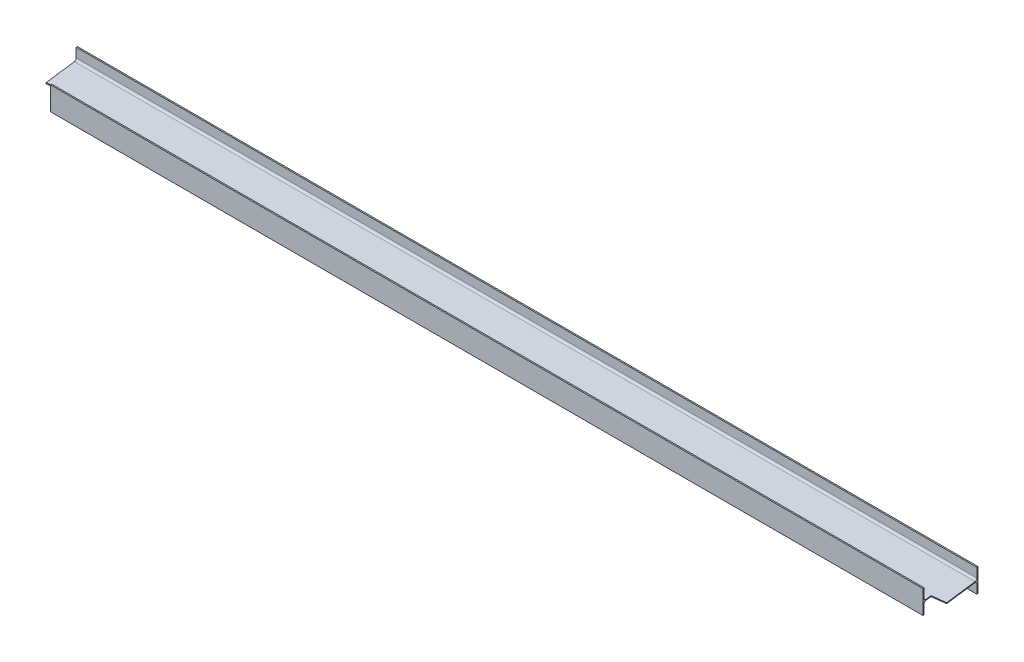
ISO-10303-21;
HEADER;
FILE_DESCRIPTION(('STEP AP214'),'2;1');
FILE_NAME('part.step','',(''),(''),'','','');
FILE_SCHEMA(('AUTOMOTIVE_DESIGN { 1 0 10303 214 1 1 1 1 }'));
ENDSEC;
DATA;
#1=APPLICATION_CONTEXT('core data for automotive mechanical design processes');
#2=APPLICATION_PROTOCOL_DEFINITION('international standard','automotive_design',2000,#1);
#3=PRODUCT_CONTEXT('',#1,'mechanical');
#4=PRODUCT('Part','Part','',(#3));
#5=PRODUCT_RELATED_PRODUCT_CATEGORY('part','',(#4));
#6=PRODUCT_DEFINITION_FORMATION('','',#4);
#7=PRODUCT_DEFINITION_CONTEXT('part definition',#1,'design');
#8=PRODUCT_DEFINITION('design','',#6,#7);
#9=PRODUCT_DEFINITION_SHAPE('','',#8);
#10=(LENGTH_UNIT() NAMED_UNIT(*) SI_UNIT(.MILLI.,.METRE.));
#11=(NAMED_UNIT(*) PLANE_ANGLE_UNIT() SI_UNIT($,.RADIAN.));
#12=(NAMED_UNIT(*) SI_UNIT($,.STERADIAN.) SOLID_ANGLE_UNIT());
#13=UNCERTAINTY_MEASURE_WITH_UNIT(LENGTH_MEASURE(1.E-05),#10,'distance_accuracy_value','');
#14=(GEOMETRIC_REPRESENTATION_CONTEXT(3) GLOBAL_UNCERTAINTY_ASSIGNED_CONTEXT((#13)) GLOBAL_UNIT_ASSIGNED_CONTEXT((#10,
#11,#12)) REPRESENTATION_CONTEXT('',''));
#15=CARTESIAN_POINT('',(0.,0.,0.));
#16=DIRECTION('',(0.,0.,1.));
#17=DIRECTION('',(1.,0.,0.));
#18=AXIS2_PLACEMENT_3D('',#15,#16,#17);
#19=CARTESIAN_POINT('',(5791.,15.7500000000001,128.));
#20=DIRECTION('',(-1.,0.,0.));
#21=DIRECTION('',(0.,0.,1.));
#22=AXIS2_PLACEMENT_3D('',#19,#20,#21);
#23=CYLINDRICAL_SURFACE('',#22,13.);
#24=DIRECTION('',(-1.,0.,0.));
#25=VECTOR('',#24,1.);
#26=CARTESIAN_POINT('',(5791.,2.75000000000004,128.));
#27=LINE('',#26,#25);
#28=CARTESIAN_POINT('',(5697.67460033164,2.75000000000004,128.));
#29=VERTEX_POINT('',#28);
#30=CARTESIAN_POINT('',(125.325399668359,2.75000000000004,128.));
#31=VERTEX_POINT('',#30);
#32=EDGE_CURVE('E271',#29,#31,#27,.T.);
#33=ORIENTED_EDGE('',*,*,#32,.T.);
#34=CARTESIAN_POINT('',(125.325399668359,15.7500000000001,128.));
#35=DIRECTION('',(0.992277876713668,0.,-0.124034734589205));
#36=DIRECTION('',(-0.124034734589205,0.,-0.992277876713668));
#37=AXIS2_PLACEMENT_3D('',#34,#35,#36);
#38=ELLIPSE('',#37,13.1011688409852,13.);
#39=CARTESIAN_POINT('',(126.950399668359,15.7500000000001,141.));
#40=VERTEX_POINT('',#39);
#41=EDGE_CURVE('E299',#31,#40,#38,.F.);
#42=ORIENTED_EDGE('',*,*,#41,.T.);
#43=DIRECTION('',(-1.,0.,0.));
#44=VECTOR('',#43,1.);
#45=CARTESIAN_POINT('',(5791.,15.7500000000001,141.));
#46=LINE('',#45,#44);
#47=CARTESIAN_POINT('',(5699.29960033164,15.7500000000001,141.));
#48=VERTEX_POINT('',#47);
#49=EDGE_CURVE('E251',#48,#40,#46,.T.);
#50=ORIENTED_EDGE('',*,*,#49,.F.);
#51=CARTESIAN_POINT('',(5697.67460033164,15.7500000000001,128.));
#52=DIRECTION('',(-0.992277876713666,0.,0.124034734589219));
#53=DIRECTION('',(-0.124034734589219,0.,-0.992277876713667));
#54=AXIS2_PLACEMENT_3D('',#51,#52,#53);
#55=ELLIPSE('',#54,13.1011688409852,13.);
#56=EDGE_CURVE('E276',#48,#29,#55,.F.);
#57=ORIENTED_EDGE('',*,*,#56,.T.);
#58=EDGE_LOOP('',(#33,#42,#50,#57));
#59=FACE_BOUND('',#58,.T.);
#60=ADVANCED_FACE('F87',(#59),#23,.F.);
#61=CARTESIAN_POINT('',(5791.,74.5,141.));
#62=DIRECTION('',(0.,0.,1.));
#63=DIRECTION('',(0.,-1.,0.));
#64=AXIS2_PLACEMENT_3D('',#61,#62,#63);
#65=PLANE('',#64);
#66=ORIENTED_EDGE('',*,*,#49,.T.);
#67=DIRECTION('',(0.,1.,0.));
#68=VECTOR('',#67,1.);
#69=CARTESIAN_POINT('',(126.950399668359,74.4999999999995,141.));
#70=LINE('',#69,#68);
#71=CARTESIAN_POINT('',(126.950399668359,74.5,141.));
#72=VERTEX_POINT('',#71);
#73=EDGE_CURVE('E301',#40,#72,#70,.T.);
#74=ORIENTED_EDGE('',*,*,#73,.T.);
#75=DIRECTION('',(-1.,0.,0.));
#76=VECTOR('',#75,1.);
#77=CARTESIAN_POINT('',(5791.,74.5,141.));
#78=LINE('',#77,#76);
#79=CARTESIAN_POINT('',(5699.29960033164,74.5,141.));
#80=VERTEX_POINT('',#79);
#81=EDGE_CURVE('E244',#80,#72,#78,.T.);
#82=ORIENTED_EDGE('',*,*,#81,.F.);
#83=DIRECTION('',(0.,-1.,0.));
#84=VECTOR('',#83,1.);
#85=CARTESIAN_POINT('',(5699.29960033164,74.5,141.));
#86=LINE('',#85,#84);
#87=EDGE_CURVE('E282',#80,#48,#86,.T.);
#88=ORIENTED_EDGE('',*,*,#87,.T.);
#89=EDGE_LOOP('',(#66,#74,#82,#88));
#90=FACE_BOUND('',#89,.T.);
#91=ADVANCED_FACE('F443',(#90),#65,.F.);
#92=CARTESIAN_POINT('',(5791.,74.5,149.));
#93=DIRECTION('',(0.,-1.,0.));
#94=DIRECTION('',(0.,0.,-1.));
#95=AXIS2_PLACEMENT_3D('',#92,#93,#94);
#96=PLANE('',#95);
#97=ORIENTED_EDGE('',*,*,#81,.T.);
#98=DIRECTION('',(-0.124034734589205,0.,-0.992277876713668));
#99=VECTOR('',#98,1.);
#100=CARTESIAN_POINT('',(117.872577482986,74.5000000000001,68.3774225170143));
#101=LINE('',#100,#99);
#102=CARTESIAN_POINT('',(127.950399668359,74.5,149.));
#103=VERTEX_POINT('',#102);
#104=EDGE_CURVE('E227',#103,#72,#101,.T.);
#105=ORIENTED_EDGE('',*,*,#104,.F.);
#106=DIRECTION('',(-1.,0.,0.));
#107=VECTOR('',#106,1.);
#108=CARTESIAN_POINT('',(5791.,74.5,149.));
#109=LINE('',#108,#107);
#110=CARTESIAN_POINT('',(5700.29960033164,74.5,149.));
#111=VERTEX_POINT('',#110);
#112=EDGE_CURVE('E242',#111,#103,#109,.T.);
#113=ORIENTED_EDGE('',*,*,#112,.F.);
#114=DIRECTION('',(0.124034734589219,0.,0.992277876713666));
#115=VECTOR('',#114,1.);
#116=CARTESIAN_POINT('',(5693.01255967453,74.5,90.703674743072));
#117=LINE('',#116,#115);
#118=EDGE_CURVE('E402',#80,#111,#117,.T.);
#119=ORIENTED_EDGE('',*,*,#118,.F.);
#120=EDGE_LOOP('',(#97,#105,#113,#119));
#121=FACE_BOUND('',#120,.T.);
#122=ADVANCED_FACE('F240',(#121),#96,.F.);
#123=CARTESIAN_POINT('',(5791.,74.5,149.));
#124=DIRECTION('',(0.,0.,-1.));
#125=DIRECTION('',(0.,1.,0.));
#126=AXIS2_PLACEMENT_3D('',#123,#124,#125);
#127=PLANE('',#126);
#128=ORIENTED_EDGE('',*,*,#112,.T.);
#129=DIRECTION('',(0.,1.,0.));
#130=VECTOR('',#129,1.);
#131=CARTESIAN_POINT('',(127.950399668359,-74.5,149.));
#132=LINE('',#131,#130);
#133=CARTESIAN_POINT('',(127.950399668359,-74.5,149.));
#134=VERTEX_POINT('',#133);
#135=EDGE_CURVE('E224',#134,#103,#132,.T.);
#136=ORIENTED_EDGE('',*,*,#135,.F.);
#137=DIRECTION('',(-1.,0.,0.));
#138=VECTOR('',#137,1.);
#139=CARTESIAN_POINT('',(5791.,-74.5,149.));
#140=LINE('',#139,#138);
#141=CARTESIAN_POINT('',(5700.29960033164,-74.5,149.));
#142=VERTEX_POINT('',#141);
#143=EDGE_CURVE('E249',#142,#134,#140,.T.);
#144=ORIENTED_EDGE('',*,*,#143,.F.);
#145=DIRECTION('',(0.,1.,0.));
#146=VECTOR('',#145,1.);
#147=CARTESIAN_POINT('',(5700.29960033164,-74.5,149.));
#148=LINE('',#147,#146);
#149=EDGE_CURVE('E245',#142,#111,#148,.T.);
#150=ORIENTED_EDGE('',*,*,#149,.T.);
#151=EDGE_LOOP('',(#128,#136,#144,#150));
#152=FACE_BOUND('',#151,.T.);
#153=ADVANCED_FACE('F248',(#152),#127,.F.);
#154=CARTESIAN_POINT('',(5791.,-74.5,149.));
#155=DIRECTION('',(0.,1.,0.));
#156=DIRECTION('',(0.,0.,1.));
#157=AXIS2_PLACEMENT_3D('',#154,#155,#156);
#158=PLANE('',#157);
#159=ORIENTED_EDGE('',*,*,#143,.T.);
#160=DIRECTION('',(-0.124034734589205,0.,-0.992277876713668));
#161=VECTOR('',#160,1.);
#162=CARTESIAN_POINT('',(117.872577482986,-74.5,68.3774225170143));
#163=LINE('',#162,#161);
#164=CARTESIAN_POINT('',(126.950399668359,-74.5,141.));
#165=VERTEX_POINT('',#164);
#166=EDGE_CURVE('E230',#134,#165,#163,.T.);
#167=ORIENTED_EDGE('',*,*,#166,.T.);
#168=DIRECTION('',(-1.,0.,0.));
#169=VECTOR('',#168,1.);
#170=CARTESIAN_POINT('',(5791.,-74.5,141.));
#171=LINE('',#170,#169);
#172=CARTESIAN_POINT('',(5699.29960033164,-74.5,141.));
#173=VERTEX_POINT('',#172);
#174=EDGE_CURVE('E253',#173,#165,#171,.T.);
#175=ORIENTED_EDGE('',*,*,#174,.F.);
#176=DIRECTION('',(0.124034734589219,0.,0.992277876713666));
#177=VECTOR('',#176,1.);
#178=CARTESIAN_POINT('',(5693.01255967453,-74.5,90.703674743072));
#179=LINE('',#178,#177);
#180=EDGE_CURVE('E398',#173,#142,#179,.T.);
#181=ORIENTED_EDGE('',*,*,#180,.T.);
#182=EDGE_LOOP('',(#159,#167,#175,#181));
#183=FACE_BOUND('',#182,.T.);
#184=ADVANCED_FACE('F397',(#183),#158,.F.);
#185=CARTESIAN_POINT('',(5791.,-15.75,141.));
#186=DIRECTION('',(0.,0.,1.));
#187=DIRECTION('',(1.,0.,0.));
#188=AXIS2_PLACEMENT_3D('',#185,#186,#187);
#189=PLANE('',#188);
#190=ORIENTED_EDGE('',*,*,#174,.T.);
#191=DIRECTION('',(0.,1.,0.));
#192=VECTOR('',#191,1.);
#193=CARTESIAN_POINT('',(126.950399668359,-15.7500000000002,141.));
#194=LINE('',#193,#192);
#195=CARTESIAN_POINT('',(126.950399668359,-15.75,141.));
#196=VERTEX_POINT('',#195);
#197=EDGE_CURVE('E309',#165,#196,#194,.T.);
#198=ORIENTED_EDGE('',*,*,#197,.T.);
#199=DIRECTION('',(-1.,0.,0.));
#200=VECTOR('',#199,1.);
#201=CARTESIAN_POINT('',(5791.,-15.75,141.));
#202=LINE('',#201,#200);
#203=CARTESIAN_POINT('',(5699.29960033164,-15.75,141.));
#204=VERTEX_POINT('',#203);
#205=EDGE_CURVE('E388',#204,#196,#202,.T.);
#206=ORIENTED_EDGE('',*,*,#205,.F.);
#207=DIRECTION('',(0.,-1.,0.));
#208=VECTOR('',#207,1.);
#209=CARTESIAN_POINT('',(5699.29960033164,-15.75,141.));
#210=LINE('',#209,#208);
#211=EDGE_CURVE('E296',#204,#173,#210,.T.);
#212=ORIENTED_EDGE('',*,*,#211,.T.);
#213=EDGE_LOOP('',(#190,#198,#206,#212));
#214=FACE_BOUND('',#213,.T.);
#215=ADVANCED_FACE('F393',(#214),#189,.F.);
#216=CARTESIAN_POINT('',(5791.,-15.75,128.));
#217=DIRECTION('',(-1.,0.,0.));
#218=DIRECTION('',(0.,0.,1.));
#219=AXIS2_PLACEMENT_3D('',#216,#217,#218);
#220=CYLINDRICAL_SURFACE('',#219,13.);
#221=ORIENTED_EDGE('',*,*,#205,.T.);
#222=CARTESIAN_POINT('',(125.325399668359,-15.75,128.));
#223=DIRECTION('',(0.992277876713668,0.,-0.124034734589205));
#224=DIRECTION('',(-0.124034734589205,0.,-0.992277876713668));
#225=AXIS2_PLACEMENT_3D('',#222,#223,#224);
#226=ELLIPSE('',#225,13.1011688409851,13.);
#227=CARTESIAN_POINT('',(125.325399668359,-2.75000000000004,128.));
#228=VERTEX_POINT('',#227);
#229=EDGE_CURVE('E306',#196,#228,#226,.F.);
#230=ORIENTED_EDGE('',*,*,#229,.T.);
#231=DIRECTION('',(-1.,0.,0.));
#232=VECTOR('',#231,1.);
#233=CARTESIAN_POINT('',(5791.,-2.75000000000004,128.));
#234=LINE('',#233,#232);
#235=CARTESIAN_POINT('',(5697.67460033164,-2.75000000000004,128.));
#236=VERTEX_POINT('',#235);
#237=EDGE_CURVE('E385',#236,#228,#234,.T.);
#238=ORIENTED_EDGE('',*,*,#237,.F.);
#239=CARTESIAN_POINT('',(5697.67460033164,-15.75,128.));
#240=DIRECTION('',(-0.992277876713666,0.,0.124034734589219));
#241=DIRECTION('',(-0.124034734589219,0.,-0.992277876713667));
#242=AXIS2_PLACEMENT_3D('',#239,#240,#241);
#243=ELLIPSE('',#242,13.1011688409852,13.);
#244=EDGE_CURVE('E293',#236,#204,#243,.F.);
#245=ORIENTED_EDGE('',*,*,#244,.T.);
#246=EDGE_LOOP('',(#221,#230,#238,#245));
#247=FACE_BOUND('',#246,.T.);
#248=ADVANCED_FACE('F446',(#247),#220,.F.);
#249=CARTESIAN_POINT('',(5791.,-2.75000000000004,128.));
#250=DIRECTION('',(0.,1.,0.));
#251=DIRECTION('',(0.,0.,1.));
#252=AXIS2_PLACEMENT_3D('',#249,#250,#251);
#253=PLANE('',#252);
#254=DIRECTION('',(-0.124034734589205,0.,-0.992277876713668));
#255=VECTOR('',#254,1.);
#256=CARTESIAN_POINT('',(212.489624288841,-2.75000000000004,825.313796963874));
#257=LINE('',#256,#255);
#258=CARTESIAN_POINT('',(117.872577482986,-2.75000000000004,68.3774225170143));
#259=VERTEX_POINT('',#258);
#260=EDGE_CURVE('E303',#228,#259,#257,.T.);
#261=ORIENTED_EDGE('',*,*,#260,.T.);
#262=DIRECTION('',(-0.992277876713668,0.,0.12403473458921));
#263=VECTOR('',#262,1.);
#264=CARTESIAN_POINT('',(5696.38295319414,-2.75000000000004,-628.936374446886));
#265=LINE('',#264,#263);
#266=CARTESIAN_POINT('',(28.5675685787561,-2.75000000000004,79.5405486300432));
#267=VERTEX_POINT('',#266);
#268=EDGE_CURVE('E283',#259,#267,#265,.T.);
#269=ORIENTED_EDGE('',*,*,#268,.T.);
#270=DIRECTION('',(-0.124034734589209,0.,-0.992277876713668));
#271=VECTOR('',#270,1.);
#272=CARTESIAN_POINT('',(123.184615384617,-2.75000000000004,836.476923076927));
#273=LINE('',#272,#271);
#274=CARTESIAN_POINT('',(2.6250000000001,-2.75000000000004,-128.));
#275=VERTEX_POINT('',#274);
#276=EDGE_CURVE('E338',#267,#275,#273,.T.);
#277=ORIENTED_EDGE('',*,*,#276,.T.);
#278=DIRECTION('',(-1.,0.,0.));
#279=VECTOR('',#278,1.);
#280=CARTESIAN_POINT('',(5791.,-2.75000000000004,-128.));
#281=LINE('',#280,#279);
#282=CARTESIAN_POINT('',(5756.375,-2.75000000000004,-128.));
#283=VERTEX_POINT('',#282);
#284=EDGE_CURVE('E382',#283,#275,#281,.T.);
#285=ORIENTED_EDGE('',*,*,#284,.F.);
#286=DIRECTION('',(0.124034734589206,0.,0.992277876713668));
#287=VECTOR('',#286,1.);
#288=CARTESIAN_POINT('',(5788.41538461539,-2.75000000000004,128.323076923077));
#289=LINE('',#288,#287);
#290=CARTESIAN_POINT('',(5782.31756857876,-2.75000000000004,79.5405486300431));
#291=VERTEX_POINT('',#290);
#292=EDGE_CURVE('E354',#283,#291,#289,.T.);
#293=ORIENTED_EDGE('',*,*,#292,.T.);
#294=DIRECTION('',(-0.992277876713667,0.,0.12403473458921));
#295=VECTOR('',#294,1.);
#296=CARTESIAN_POINT('',(5784.90218396337,-2.75000000000004,79.2174717069663));
#297=LINE('',#296,#295);
#298=CARTESIAN_POINT('',(5693.01255967453,-2.75000000000004,90.703674743072));
#299=VERTEX_POINT('',#298);
#300=EDGE_CURVE('E109',#291,#299,#297,.T.);
#301=ORIENTED_EDGE('',*,*,#300,.T.);
#302=DIRECTION('',(0.124034734589219,0.,0.992277876713667));
#303=VECTOR('',#302,1.);
#304=CARTESIAN_POINT('',(5699.11037571116,-2.75000000000004,139.486203036106));
#305=LINE('',#304,#303);
#306=EDGE_CURVE('E285',#299,#236,#305,.T.);
#307=ORIENTED_EDGE('',*,*,#306,.T.);
#308=ORIENTED_EDGE('',*,*,#237,.T.);
#309=EDGE_LOOP('',(#261,#269,#277,#285,#293,#301,#307,#308));
#310=FACE_BOUND('',#309,.T.);
#311=ADVANCED_FACE('F439',(#310),#253,.F.);
#312=CARTESIAN_POINT('',(5791.,-15.75,-128.));
#313=DIRECTION('',(-1.,0.,0.));
#314=DIRECTION('',(0.,0.,1.));
#315=AXIS2_PLACEMENT_3D('',#312,#313,#314);
#316=CYLINDRICAL_SURFACE('',#315,13.);
#317=ORIENTED_EDGE('',*,*,#284,.T.);
#318=CARTESIAN_POINT('',(2.6250000000001,-15.75,-128.));
#319=DIRECTION('',(0.992277876713668,0.,-0.124034734589209));
#320=DIRECTION('',(-0.124034734589209,0.,-0.992277876713668));
#321=AXIS2_PLACEMENT_3D('',#318,#319,#320);
#322=ELLIPSE('',#321,13.1011688409851,13.);
#323=CARTESIAN_POINT('',(1.00000000000033,-15.75,-141.));
#324=VERTEX_POINT('',#323);
#325=EDGE_CURVE('E335',#275,#324,#322,.F.);
#326=ORIENTED_EDGE('',*,*,#325,.T.);
#327=DIRECTION('',(-1.,0.,0.));
#328=VECTOR('',#327,1.);
#329=CARTESIAN_POINT('',(5791.,-15.75,-141.));
#330=LINE('',#329,#328);
#331=CARTESIAN_POINT('',(5754.75,-15.75,-141.));
#332=VERTEX_POINT('',#331);
#333=EDGE_CURVE('E379',#332,#324,#330,.T.);
#334=ORIENTED_EDGE('',*,*,#333,.F.);
#335=CARTESIAN_POINT('',(5756.375,-15.75,-128.));
#336=DIRECTION('',(-0.992277876713668,0.,0.124034734589206));
#337=DIRECTION('',(-0.124034734589206,0.,-0.992277876713668));
#338=AXIS2_PLACEMENT_3D('',#335,#336,#337);
#339=ELLIPSE('',#338,13.1011688409851,13.);
#340=EDGE_CURVE('E351',#332,#283,#339,.F.);
#341=ORIENTED_EDGE('',*,*,#340,.T.);
#342=EDGE_LOOP('',(#317,#326,#334,#341));
#343=FACE_BOUND('',#342,.T.);
#344=ADVANCED_FACE('F436',(#343),#316,.F.);
#345=CARTESIAN_POINT('',(5791.,-15.75,-141.));
#346=DIRECTION('',(0.,0.,-1.));
#347=DIRECTION('',(-1.,0.,0.));
#348=AXIS2_PLACEMENT_3D('',#345,#346,#347);
#349=PLANE('',#348);
#350=ORIENTED_EDGE('',*,*,#333,.T.);
#351=DIRECTION('',(0.,-1.,0.));
#352=VECTOR('',#351,1.);
#353=CARTESIAN_POINT('',(1.00000000000033,-15.75,-141.));
#354=LINE('',#353,#352);
#355=CARTESIAN_POINT('',(1.,-74.5,-141.));
#356=VERTEX_POINT('',#355);
#357=EDGE_CURVE('E332',#324,#356,#354,.T.);
#358=ORIENTED_EDGE('',*,*,#357,.T.);
#359=DIRECTION('',(-1.,0.,0.));
#360=VECTOR('',#359,1.);
#361=CARTESIAN_POINT('',(5791.,-74.5,-141.));
#362=LINE('',#361,#360);
#363=CARTESIAN_POINT('',(5754.75,-74.5,-141.));
#364=VERTEX_POINT('',#363);
#365=EDGE_CURVE('E376',#364,#356,#362,.T.);
#366=ORIENTED_EDGE('',*,*,#365,.F.);
#367=DIRECTION('',(0.,1.,0.));
#368=VECTOR('',#367,1.);
#369=CARTESIAN_POINT('',(5754.75,-15.75,-141.));
#370=LINE('',#369,#368);
#371=EDGE_CURVE('E348',#364,#332,#370,.T.);
#372=ORIENTED_EDGE('',*,*,#371,.T.);
#373=EDGE_LOOP('',(#350,#358,#366,#372));
#374=FACE_BOUND('',#373,.T.);
#375=ADVANCED_FACE('F432',(#374),#349,.F.);
#376=CARTESIAN_POINT('',(5791.,-74.5,-141.));
#377=DIRECTION('',(0.,1.,0.));
#378=DIRECTION('',(0.,0.,1.));
#379=AXIS2_PLACEMENT_3D('',#376,#377,#378);
#380=PLANE('',#379);
#381=ORIENTED_EDGE('',*,*,#365,.T.);
#382=DIRECTION('',(-0.124034734589209,0.,-0.992277876713668));
#383=VECTOR('',#382,1.);
#384=CARTESIAN_POINT('',(0.,-74.5,-149.));
#385=LINE('',#384,#383);
#386=CARTESIAN_POINT('',(0.,-74.5,-149.));
#387=VERTEX_POINT('',#386);
#388=EDGE_CURVE('E313',#356,#387,#385,.T.);
#389=ORIENTED_EDGE('',*,*,#388,.T.);
#390=DIRECTION('',(-1.,0.,0.));
#391=VECTOR('',#390,1.);
#392=CARTESIAN_POINT('',(5791.,-74.5,-149.));
#393=LINE('',#392,#391);
#394=CARTESIAN_POINT('',(5753.75,-74.5,-149.));
#395=VERTEX_POINT('',#394);
#396=EDGE_CURVE('E373',#395,#387,#393,.T.);
#397=ORIENTED_EDGE('',*,*,#396,.F.);
#398=DIRECTION('',(0.124034734589206,0.,0.992277876713668));
#399=VECTOR('',#398,1.);
#400=CARTESIAN_POINT('',(5753.75,-74.5,-149.));
#401=LINE('',#400,#399);
#402=EDGE_CURVE('E320',#395,#364,#401,.T.);
#403=ORIENTED_EDGE('',*,*,#402,.T.);
#404=EDGE_LOOP('',(#381,#389,#397,#403));
#405=FACE_BOUND('',#404,.T.);
#406=ADVANCED_FACE('F429',(#405),#380,.F.);
#407=CARTESIAN_POINT('',(5791.,74.5,-149.));
#408=DIRECTION('',(0.,0.,1.));
#409=DIRECTION('',(0.,-1.,0.));
#410=AXIS2_PLACEMENT_3D('',#407,#408,#409);
#411=PLANE('',#410);
#412=DIRECTION('',(-1.,0.,0.));
#413=VECTOR('',#412,1.);
#414=CARTESIAN_POINT('',(5791.,74.5,-149.));
#415=LINE('',#414,#413);
#416=CARTESIAN_POINT('',(5753.75,74.5,-149.));
#417=VERTEX_POINT('',#416);
#418=CARTESIAN_POINT('',(0.,74.5,-149.));
#419=VERTEX_POINT('',#418);
#420=EDGE_CURVE('E370',#417,#419,#415,.T.);
#421=ORIENTED_EDGE('',*,*,#420,.F.);
#422=DIRECTION('',(0.,1.,0.));
#423=VECTOR('',#422,1.);
#424=CARTESIAN_POINT('',(5753.75,-74.5,-149.));
#425=LINE('',#424,#423);
#426=EDGE_CURVE('E319',#395,#417,#425,.T.);
#427=ORIENTED_EDGE('',*,*,#426,.F.);
#428=ORIENTED_EDGE('',*,*,#396,.T.);
#429=DIRECTION('',(0.,1.,0.));
#430=VECTOR('',#429,1.);
#431=CARTESIAN_POINT('',(0.,74.5,-149.));
#432=LINE('',#431,#430);
#433=EDGE_CURVE('E357',#387,#419,#432,.T.);
#434=ORIENTED_EDGE('',*,*,#433,.T.);
#435=EDGE_LOOP('',(#421,#427,#428,#434));
#436=FACE_BOUND('',#435,.T.);
#437=ADVANCED_FACE('F426',(#436),#411,.F.);
#438=CARTESIAN_POINT('',(5791.,74.5,-141.));
#439=DIRECTION('',(0.,-1.,0.));
#440=DIRECTION('',(0.,0.,-1.));
#441=AXIS2_PLACEMENT_3D('',#438,#439,#440);
#442=PLANE('',#441);
#443=ORIENTED_EDGE('',*,*,#420,.T.);
#444=DIRECTION('',(-0.124034734589209,0.,-0.992277876713668));
#445=VECTOR('',#444,1.);
#446=CARTESIAN_POINT('',(0.,74.5,-149.));
#447=LINE('',#446,#445);
#448=CARTESIAN_POINT('',(1.00000000000017,74.5,-141.));
#449=VERTEX_POINT('',#448);
#450=EDGE_CURVE('E317',#449,#419,#447,.T.);
#451=ORIENTED_EDGE('',*,*,#450,.F.);
#452=DIRECTION('',(-1.,0.,0.));
#453=VECTOR('',#452,1.);
#454=CARTESIAN_POINT('',(5791.,74.5,-141.));
#455=LINE('',#454,#453);
#456=CARTESIAN_POINT('',(5754.75,74.5,-141.));
#457=VERTEX_POINT('',#456);
#458=EDGE_CURVE('E367',#457,#449,#455,.T.);
#459=ORIENTED_EDGE('',*,*,#458,.F.);
#460=DIRECTION('',(0.124034734589206,0.,0.992277876713668));
#461=VECTOR('',#460,1.);
#462=CARTESIAN_POINT('',(5753.75,74.5,-149.));
#463=LINE('',#462,#461);
#464=EDGE_CURVE('E312',#417,#457,#463,.T.);
#465=ORIENTED_EDGE('',*,*,#464,.F.);
#466=EDGE_LOOP('',(#443,#451,#459,#465));
#467=FACE_BOUND('',#466,.T.);
#468=ADVANCED_FACE('F421',(#467),#442,.F.);
#469=CARTESIAN_POINT('',(5791.,74.5,-141.));
#470=DIRECTION('',(0.,0.,-1.));
#471=DIRECTION('',(0.,1.,0.));
#472=AXIS2_PLACEMENT_3D('',#469,#470,#471);
#473=PLANE('',#472);
#474=ORIENTED_EDGE('',*,*,#458,.T.);
#475=DIRECTION('',(0.,-1.,0.));
#476=VECTOR('',#475,1.);
#477=CARTESIAN_POINT('',(1.00000000000033,74.5000000000004,-141.));
#478=LINE('',#477,#476);
#479=CARTESIAN_POINT('',(1.00000000000033,15.7500000000001,-141.));
#480=VERTEX_POINT('',#479);
#481=EDGE_CURVE('E329',#449,#480,#478,.T.);
#482=ORIENTED_EDGE('',*,*,#481,.T.);
#483=DIRECTION('',(-1.,0.,0.));
#484=VECTOR('',#483,1.);
#485=CARTESIAN_POINT('',(5791.,15.7500000000001,-141.));
#486=LINE('',#485,#484);
#487=CARTESIAN_POINT('',(5754.75,15.7500000000001,-141.));
#488=VERTEX_POINT('',#487);
#489=EDGE_CURVE('E364',#488,#480,#486,.T.);
#490=ORIENTED_EDGE('',*,*,#489,.F.);
#491=DIRECTION('',(0.,1.,0.));
#492=VECTOR('',#491,1.);
#493=CARTESIAN_POINT('',(5754.75,74.5,-141.));
#494=LINE('',#493,#492);
#495=EDGE_CURVE('E345',#488,#457,#494,.T.);
#496=ORIENTED_EDGE('',*,*,#495,.T.);
#497=EDGE_LOOP('',(#474,#482,#490,#496));
#498=FACE_BOUND('',#497,.T.);
#499=ADVANCED_FACE('F417',(#498),#473,.F.);
#500=CARTESIAN_POINT('',(5791.,15.7500000000001,-128.));
#501=DIRECTION('',(-1.,0.,0.));
#502=DIRECTION('',(0.,0.,1.));
#503=AXIS2_PLACEMENT_3D('',#500,#501,#502);
#504=CYLINDRICAL_SURFACE('',#503,13.);
#505=ORIENTED_EDGE('',*,*,#489,.T.);
#506=CARTESIAN_POINT('',(2.6250000000001,15.7500000000001,-128.));
#507=DIRECTION('',(0.992277876713668,0.,-0.124034734589209));
#508=DIRECTION('',(-0.124034734589209,0.,-0.992277876713668));
#509=AXIS2_PLACEMENT_3D('',#506,#507,#508);
#510=ELLIPSE('',#509,13.1011688409851,13.);
#511=CARTESIAN_POINT('',(2.62500000000054,2.7500000000001,-128.));
#512=VERTEX_POINT('',#511);
#513=EDGE_CURVE('E326',#480,#512,#510,.F.);
#514=ORIENTED_EDGE('',*,*,#513,.T.);
#515=DIRECTION('',(-1.,0.,0.));
#516=VECTOR('',#515,1.);
#517=CARTESIAN_POINT('',(5791.,2.7500000000001,-128.));
#518=LINE('',#517,#516);
#519=CARTESIAN_POINT('',(5756.375,2.7500000000001,-128.));
#520=VERTEX_POINT('',#519);
#521=EDGE_CURVE('E361',#520,#512,#518,.T.);
#522=ORIENTED_EDGE('',*,*,#521,.F.);
#523=CARTESIAN_POINT('',(5756.375,15.7500000000001,-128.));
#524=DIRECTION('',(-0.992277876713668,0.,0.124034734589206));
#525=DIRECTION('',(-0.124034734589206,0.,-0.992277876713668));
#526=AXIS2_PLACEMENT_3D('',#523,#524,#525);
#527=ELLIPSE('',#526,13.1011688409851,13.);
#528=EDGE_CURVE('E342',#520,#488,#527,.F.);
#529=ORIENTED_EDGE('',*,*,#528,.T.);
#530=EDGE_LOOP('',(#505,#514,#522,#529));
#531=FACE_BOUND('',#530,.T.);
#532=ADVANCED_FACE('F413',(#531),#504,.F.);
#533=CARTESIAN_POINT('',(5791.,2.75000000000004,128.));
#534=DIRECTION('',(0.,-1.,0.));
#535=DIRECTION('',(0.,0.,-1.));
#536=AXIS2_PLACEMENT_3D('',#533,#534,#535);
#537=PLANE('',#536);
#538=DIRECTION('',(0.124034734589209,0.,0.992277876713668));
#539=VECTOR('',#538,1.);
#540=CARTESIAN_POINT('',(123.184615384617,2.74999999999986,836.476923076927));
#541=LINE('',#540,#539);
#542=CARTESIAN_POINT('',(28.5675685787561,2.75000000000005,79.540548630043));
#543=VERTEX_POINT('',#542);
#544=EDGE_CURVE('E316',#512,#543,#541,.T.);
#545=ORIENTED_EDGE('',*,*,#544,.T.);
#546=DIRECTION('',(0.992277876713668,0.,-0.12403473458921));
#547=VECTOR('',#546,1.);
#548=CARTESIAN_POINT('',(5696.38295319414,2.75000000000023,-628.936374446886));
#549=LINE('',#548,#547);
#550=CARTESIAN_POINT('',(117.872577482986,2.75000000000004,68.3774225170143));
#551=VERTEX_POINT('',#550);
#552=EDGE_CURVE('E101',#543,#551,#549,.T.);
#553=ORIENTED_EDGE('',*,*,#552,.T.);
#554=DIRECTION('',(0.124034734589205,0.,0.992277876713668));
#555=VECTOR('',#554,1.);
#556=CARTESIAN_POINT('',(212.489624288841,2.74999999999987,825.313796963874));
#557=LINE('',#556,#555);
#558=EDGE_CURVE('E13',#551,#31,#557,.T.);
#559=ORIENTED_EDGE('',*,*,#558,.T.);
#560=ORIENTED_EDGE('',*,*,#32,.F.);
#561=DIRECTION('',(-0.124034734589219,0.,-0.992277876713667));
#562=VECTOR('',#561,1.);
#563=CARTESIAN_POINT('',(5699.11037571116,2.75000000000004,139.486203036106));
#564=LINE('',#563,#562);
#565=CARTESIAN_POINT('',(5693.01255967453,2.75000000000004,90.703674743072));
#566=VERTEX_POINT('',#565);
#567=EDGE_CURVE('E94',#29,#566,#564,.T.);
#568=ORIENTED_EDGE('',*,*,#567,.T.);
#569=DIRECTION('',(0.992277876713667,0.,-0.12403473458921));
#570=VECTOR('',#569,1.);
#571=CARTESIAN_POINT('',(5784.90218396337,2.75000000000005,79.2174717069663));
#572=LINE('',#571,#570);
#573=CARTESIAN_POINT('',(5782.31756857876,2.75000000000007,79.5405486300431));
#574=VERTEX_POINT('',#573);
#575=EDGE_CURVE('E268',#566,#574,#572,.T.);
#576=ORIENTED_EDGE('',*,*,#575,.T.);
#577=DIRECTION('',(-0.124034734589206,0.,-0.992277876713668));
#578=VECTOR('',#577,1.);
#579=CARTESIAN_POINT('',(5788.41538461539,2.75000000000004,128.323076923077));
#580=LINE('',#579,#578);
#581=EDGE_CURVE('E340',#574,#520,#580,.T.);
#582=ORIENTED_EDGE('',*,*,#581,.T.);
#583=ORIENTED_EDGE('',*,*,#521,.T.);
#584=EDGE_LOOP('',(#545,#553,#559,#560,#568,#576,#582,#583));
#585=FACE_BOUND('',#584,.T.);
#586=ADVANCED_FACE('F267',(#585),#537,.F.);
#587=CARTESIAN_POINT('',(0.,-74.5,-149.));
#588=DIRECTION('',(0.992277876713668,0.,-0.124034734589209));
#589=DIRECTION('',(-0.124034734589209,0.,-0.992277876713668));
#590=AXIS2_PLACEMENT_3D('',#587,#588,#589);
#591=PLANE('',#590);
#592=ORIENTED_EDGE('',*,*,#276,.F.);
#593=DIRECTION('',(0.,1.,0.));
#594=VECTOR('',#593,1.);
#595=CARTESIAN_POINT('',(28.5675685787556,-74.5,79.5405486300432));
#596=LINE('',#595,#594);
#597=EDGE_CURVE('E261',#267,#543,#596,.T.);
#598=ORIENTED_EDGE('',*,*,#597,.T.);
#599=ORIENTED_EDGE('',*,*,#544,.F.);
#600=ORIENTED_EDGE('',*,*,#513,.F.);
#601=ORIENTED_EDGE('',*,*,#481,.F.);
#602=ORIENTED_EDGE('',*,*,#450,.T.);
#603=ORIENTED_EDGE('',*,*,#433,.F.);
#604=ORIENTED_EDGE('',*,*,#388,.F.);
#605=ORIENTED_EDGE('',*,*,#357,.F.);
#606=ORIENTED_EDGE('',*,*,#325,.F.);
#607=EDGE_LOOP('',(#592,#598,#599,#600,#601,#602,#603,#604,#605,#606));
#608=FACE_BOUND('',#607,.T.);
#609=ADVANCED_FACE('F411',(#608),#591,.F.);
#610=CARTESIAN_POINT('',(5753.75,-74.5,-149.));
#611=DIRECTION('',(-0.992277876713668,0.,0.124034734589206));
#612=DIRECTION('',(0.124034734589206,0.,0.992277876713668));
#613=AXIS2_PLACEMENT_3D('',#610,#611,#612);
#614=PLANE('',#613);
#615=ORIENTED_EDGE('',*,*,#581,.F.);
#616=DIRECTION('',(0.,-1.,0.));
#617=VECTOR('',#616,1.);
#618=CARTESIAN_POINT('',(5782.31756857876,-74.5,79.5405486300431));
#619=LINE('',#618,#617);
#620=EDGE_CURVE('E259',#574,#291,#619,.T.);
#621=ORIENTED_EDGE('',*,*,#620,.T.);
#622=ORIENTED_EDGE('',*,*,#292,.F.);
#623=ORIENTED_EDGE('',*,*,#340,.F.);
#624=ORIENTED_EDGE('',*,*,#371,.F.);
#625=ORIENTED_EDGE('',*,*,#402,.F.);
#626=ORIENTED_EDGE('',*,*,#426,.T.);
#627=ORIENTED_EDGE('',*,*,#464,.T.);
#628=ORIENTED_EDGE('',*,*,#495,.F.);
#629=ORIENTED_EDGE('',*,*,#528,.F.);
#630=EDGE_LOOP('',(#615,#621,#622,#623,#624,#625,#626,#627,#628,#629));
#631=FACE_BOUND('',#630,.T.);
#632=ADVANCED_FACE('F449',(#631),#614,.F.);
#633=CARTESIAN_POINT('',(5693.01255967453,-74.5,90.703674743072));
#634=DIRECTION('',(-0.992277876713666,0.,0.124034734589219));
#635=DIRECTION('',(0.124034734589219,0.,0.992277876713667));
#636=AXIS2_PLACEMENT_3D('',#633,#634,#635);
#637=PLANE('',#636);
#638=ORIENTED_EDGE('',*,*,#244,.F.);
#639=ORIENTED_EDGE('',*,*,#306,.F.);
#640=DIRECTION('',(0.,1.,0.));
#641=VECTOR('',#640,1.);
#642=CARTESIAN_POINT('',(5693.01255967453,-74.5,90.703674743072));
#643=LINE('',#642,#641);
#644=EDGE_CURVE('E278',#299,#566,#643,.T.);
#645=ORIENTED_EDGE('',*,*,#644,.T.);
#646=ORIENTED_EDGE('',*,*,#567,.F.);
#647=ORIENTED_EDGE('',*,*,#56,.F.);
#648=ORIENTED_EDGE('',*,*,#87,.F.);
#649=ORIENTED_EDGE('',*,*,#118,.T.);
#650=ORIENTED_EDGE('',*,*,#149,.F.);
#651=ORIENTED_EDGE('',*,*,#180,.F.);
#652=ORIENTED_EDGE('',*,*,#211,.F.);
#653=EDGE_LOOP('',(#638,#639,#645,#646,#647,#648,#649,#650,#651,#652));
#654=FACE_BOUND('',#653,.T.);
#655=ADVANCED_FACE('F275',(#654),#637,.F.);
#656=CARTESIAN_POINT('',(5782.31756857876,-74.5,79.5405486300431));
#657=DIRECTION('',(-0.12403473458921,0.,-0.992277876713667));
#658=DIRECTION('',(-0.992277876713667,0.,0.12403473458921));
#659=AXIS2_PLACEMENT_3D('',#656,#657,#658);
#660=PLANE('',#659);
#661=ORIENTED_EDGE('',*,*,#620,.F.);
#662=ORIENTED_EDGE('',*,*,#575,.F.);
#663=ORIENTED_EDGE('',*,*,#644,.F.);
#664=ORIENTED_EDGE('',*,*,#300,.F.);
#665=EDGE_LOOP('',(#661,#662,#663,#664));
#666=FACE_BOUND('',#665,.T.);
#667=ADVANCED_FACE('F447',(#666),#660,.F.);
#668=CARTESIAN_POINT('',(117.872577482986,-74.5,68.3774225170143));
#669=DIRECTION('',(0.992277876713668,0.,-0.124034734589205));
#670=DIRECTION('',(-0.124034734589205,0.,-0.992277876713668));
#671=AXIS2_PLACEMENT_3D('',#668,#669,#670);
#672=PLANE('',#671);
#673=ORIENTED_EDGE('',*,*,#166,.F.);
#674=ORIENTED_EDGE('',*,*,#135,.T.);
#675=ORIENTED_EDGE('',*,*,#104,.T.);
#676=ORIENTED_EDGE('',*,*,#73,.F.);
#677=ORIENTED_EDGE('',*,*,#41,.F.);
#678=ORIENTED_EDGE('',*,*,#558,.F.);
#679=DIRECTION('',(0.,1.,0.));
#680=VECTOR('',#679,1.);
#681=CARTESIAN_POINT('',(117.872577482986,-74.5,68.3774225170143));
#682=LINE('',#681,#680);
#683=EDGE_CURVE('E235',#259,#551,#682,.T.);
#684=ORIENTED_EDGE('',*,*,#683,.F.);
#685=ORIENTED_EDGE('',*,*,#260,.F.);
#686=ORIENTED_EDGE('',*,*,#229,.F.);
#687=ORIENTED_EDGE('',*,*,#197,.F.);
#688=EDGE_LOOP('',(#673,#674,#675,#676,#677,#678,#684,#685,#686,#687));
#689=FACE_BOUND('',#688,.T.);
#690=ADVANCED_FACE('F226',(#689),#672,.F.);
#691=CARTESIAN_POINT('',(28.5675685787561,-74.5,79.5405486300432));
#692=DIRECTION('',(-0.12403473458921,0.,-0.992277876713668));
#693=DIRECTION('',(-0.992277876713668,0.,0.12403473458921));
#694=AXIS2_PLACEMENT_3D('',#691,#692,#693);
#695=PLANE('',#694);
#696=ORIENTED_EDGE('',*,*,#683,.T.);
#697=ORIENTED_EDGE('',*,*,#552,.F.);
#698=ORIENTED_EDGE('',*,*,#597,.F.);
#699=ORIENTED_EDGE('',*,*,#268,.F.);
#700=EDGE_LOOP('',(#696,#697,#698,#699));
#701=FACE_BOUND('',#700,.T.);
#702=ADVANCED_FACE('F441',(#701),#695,.F.);
#703=CLOSED_SHELL('',(#60,#91,#122,#153,#184,#215,#248,#311,#344,#375,#406,#437,#468,#499,#532,
#586,#609,#632,#655,#667,#690,#702));
#704=MANIFOLD_SOLID_BREP('B2',#703);
#705=ADVANCED_BREP_SHAPE_REPRESENTATION('',(#18,#704),#14);
#706=SHAPE_DEFINITION_REPRESENTATION(#9,#705);
ENDSEC;
END-ISO-10303-21;
